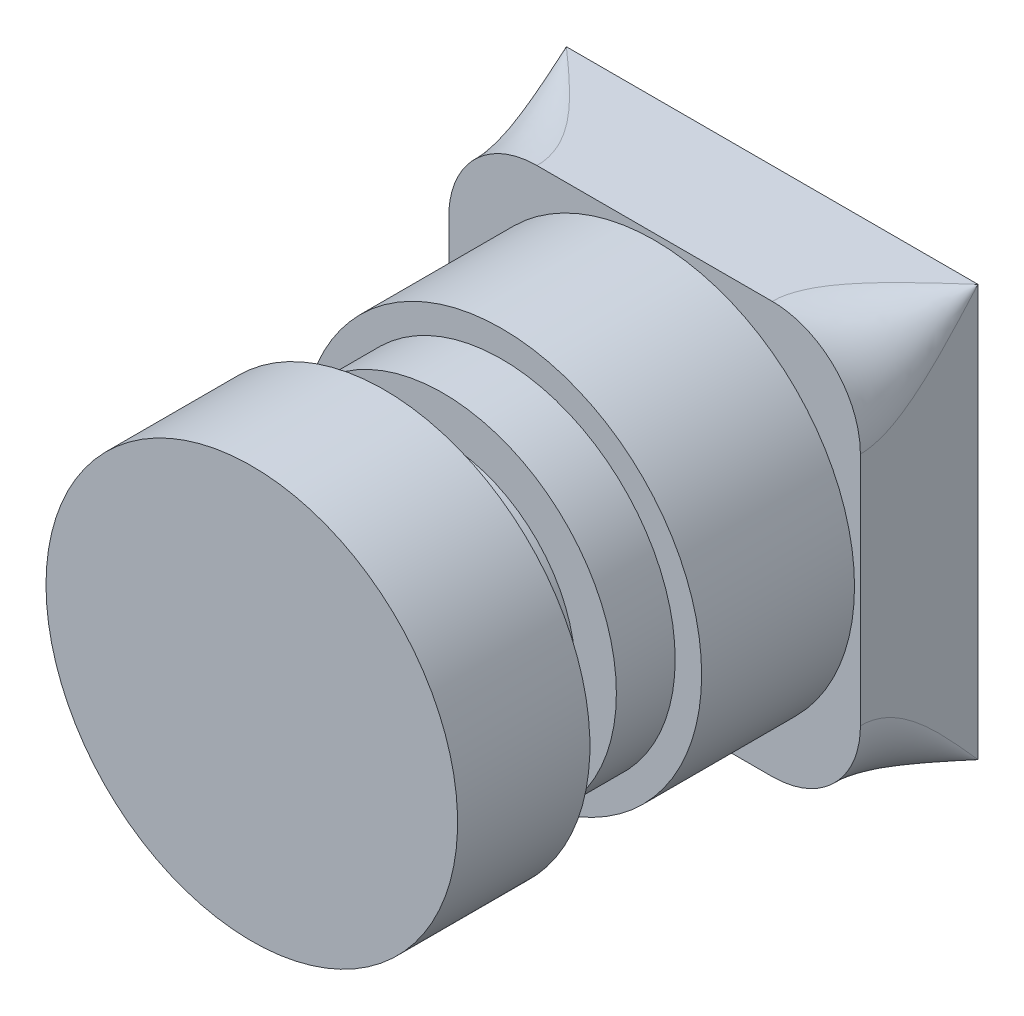
ISO-10303-21;
HEADER;
FILE_DESCRIPTION(('STEP AP214'),'2;1');
FILE_NAME('part.step','',(''),(''),'','','');
FILE_SCHEMA(('AUTOMOTIVE_DESIGN { 1 0 10303 214 1 1 1 1 }'));
ENDSEC;
DATA;
#1=APPLICATION_CONTEXT('core data for automotive mechanical design processes');
#2=APPLICATION_PROTOCOL_DEFINITION('international standard','automotive_design',2000,#1);
#3=PRODUCT_CONTEXT('',#1,'mechanical');
#4=PRODUCT('Part','Part','',(#3));
#5=PRODUCT_RELATED_PRODUCT_CATEGORY('part','',(#4));
#6=PRODUCT_DEFINITION_FORMATION('','',#4);
#7=PRODUCT_DEFINITION_CONTEXT('part definition',#1,'design');
#8=PRODUCT_DEFINITION('design','',#6,#7);
#9=PRODUCT_DEFINITION_SHAPE('','',#8);
#10=(LENGTH_UNIT() NAMED_UNIT(*) SI_UNIT(.MILLI.,.METRE.));
#11=(NAMED_UNIT(*) PLANE_ANGLE_UNIT() SI_UNIT($,.RADIAN.));
#12=(NAMED_UNIT(*) SI_UNIT($,.STERADIAN.) SOLID_ANGLE_UNIT());
#13=UNCERTAINTY_MEASURE_WITH_UNIT(LENGTH_MEASURE(1.E-05),#10,'distance_accuracy_value','');
#14=(GEOMETRIC_REPRESENTATION_CONTEXT(3) GLOBAL_UNCERTAINTY_ASSIGNED_CONTEXT((#13)) GLOBAL_UNIT_ASSIGNED_CONTEXT((#10,
#11,#12)) REPRESENTATION_CONTEXT('',''));
#15=CARTESIAN_POINT('',(0.,0.,0.));
#16=DIRECTION('',(0.,0.,1.));
#17=DIRECTION('',(1.,0.,0.));
#18=AXIS2_PLACEMENT_3D('',#15,#16,#17);
#19=CARTESIAN_POINT('',(0.,0.,4.));
#20=DIRECTION('',(1.,0.,0.));
#21=DIRECTION('',(0.,0.,-1.));
#22=AXIS2_PLACEMENT_3D('',#19,#20,#21);
#23=PLANE('',#22);
#24=DIRECTION('',(0.,-1.,0.));
#25=VECTOR('',#24,1.);
#26=CARTESIAN_POINT('',(0.,0.,0.));
#27=LINE('',#26,#25);
#28=CARTESIAN_POINT('',(0.,14.,0.));
#29=VERTEX_POINT('',#28);
#30=CARTESIAN_POINT('',(0.,0.,0.));
#31=VERTEX_POINT('',#30);
#32=EDGE_CURVE('E120',#29,#31,#27,.T.);
#33=ORIENTED_EDGE('',*,*,#32,.T.);
#34=CARTESIAN_POINT('',(0.,3.,12.));
#35=CARTESIAN_POINT('',(0.,3.,9.33333333333333));
#36=CARTESIAN_POINT('',(0.,3.,6.66666666666667));
#37=CARTESIAN_POINT('',(0.,3.,4.));
#38=CARTESIAN_POINT('',(0.,3.,2.66666666666667));
#39=CARTESIAN_POINT('',(0.,1.5,1.33333333333333));
#40=CARTESIAN_POINT('',(0.,0.,0.));
#41=(BOUNDED_CURVE() B_SPLINE_CURVE(3,(#34,#35,#36,#37,#38,#39,#40),.UNSPECIFIED.,.F.,
.F.) B_SPLINE_CURVE_WITH_KNOTS((4,3,4),(-0.008,0.,0.004),
.UNSPECIFIED.) CURVE() GEOMETRIC_REPRESENTATION_ITEM() RATIONAL_B_SPLINE_CURVE((1.,1.,1.,1.,1.,
1.,1.)) REPRESENTATION_ITEM(''));
#42=CARTESIAN_POINT('',(0.,3.,4.));
#43=VERTEX_POINT('',#42);
#44=EDGE_CURVE('E94',#31,#43,#41,.F.);
#45=ORIENTED_EDGE('',*,*,#44,.T.);
#46=DIRECTION('',(0.,-1.,0.));
#47=VECTOR('',#46,1.);
#48=CARTESIAN_POINT('',(0.,0.,4.));
#49=LINE('',#48,#47);
#50=CARTESIAN_POINT('',(0.,11.,4.));
#51=VERTEX_POINT('',#50);
#52=EDGE_CURVE('E138',#51,#43,#49,.T.);
#53=ORIENTED_EDGE('',*,*,#52,.F.);
#54=CARTESIAN_POINT('',(0.,11.,12.));
#55=CARTESIAN_POINT('',(0.,11.,9.33333333333333));
#56=CARTESIAN_POINT('',(0.,11.,6.66666666666667));
#57=CARTESIAN_POINT('',(0.,11.,4.));
#58=CARTESIAN_POINT('',(0.,11.,2.66666666666667));
#59=CARTESIAN_POINT('',(0.,12.5,1.33333333333333));
#60=CARTESIAN_POINT('',(0.,14.,0.));
#61=(BOUNDED_CURVE() B_SPLINE_CURVE(3,(#54,#55,#56,#57,#58,#59,#60),.UNSPECIFIED.,.F.,
.F.) B_SPLINE_CURVE_WITH_KNOTS((4,3,4),(-0.008,0.,0.004),
.UNSPECIFIED.) CURVE() GEOMETRIC_REPRESENTATION_ITEM() RATIONAL_B_SPLINE_CURVE((1.,1.,1.,1.,1.,
1.,1.)) REPRESENTATION_ITEM(''));
#62=EDGE_CURVE('E103',#51,#29,#61,.T.);
#63=ORIENTED_EDGE('',*,*,#62,.T.);
#64=EDGE_LOOP('',(#33,#45,#53,#63));
#65=FACE_BOUND('',#64,.T.);
#66=ADVANCED_FACE('F36',(#65),#23,.F.);
#67=CARTESIAN_POINT('',(0.,0.,4.));
#68=DIRECTION('',(0.,1.,0.));
#69=DIRECTION('',(0.,0.,1.));
#70=AXIS2_PLACEMENT_3D('',#67,#68,#69);
#71=PLANE('',#70);
#72=DIRECTION('',(1.,0.,0.));
#73=VECTOR('',#72,1.);
#74=CARTESIAN_POINT('',(0.,0.,4.));
#75=LINE('',#74,#73);
#76=CARTESIAN_POINT('',(3.,0.,4.));
#77=VERTEX_POINT('',#76);
#78=CARTESIAN_POINT('',(11.,0.,4.));
#79=VERTEX_POINT('',#78);
#80=EDGE_CURVE('E113',#77,#79,#75,.T.);
#81=ORIENTED_EDGE('',*,*,#80,.F.);
#82=CARTESIAN_POINT('',(3.,0.,12.));
#83=CARTESIAN_POINT('',(3.,0.,9.33333333333333));
#84=CARTESIAN_POINT('',(3.,0.,6.66666666666667));
#85=CARTESIAN_POINT('',(3.,0.,4.));
#86=CARTESIAN_POINT('',(3.,0.,2.66666666666667));
#87=CARTESIAN_POINT('',(1.5,0.,1.33333333333333));
#88=CARTESIAN_POINT('',(0.,0.,0.));
#89=(BOUNDED_CURVE() B_SPLINE_CURVE(3,(#82,#83,#84,#85,#86,#87,#88),.UNSPECIFIED.,.F.,
.F.) B_SPLINE_CURVE_WITH_KNOTS((4,3,4),(-0.008,0.,0.004),
.UNSPECIFIED.) CURVE() GEOMETRIC_REPRESENTATION_ITEM() RATIONAL_B_SPLINE_CURVE((1.,1.,1.,1.,1.,
1.,1.)) REPRESENTATION_ITEM(''));
#90=EDGE_CURVE('E97',#77,#31,#89,.T.);
#91=ORIENTED_EDGE('',*,*,#90,.T.);
#92=DIRECTION('',(1.,0.,0.));
#93=VECTOR('',#92,1.);
#94=CARTESIAN_POINT('',(0.,0.,0.));
#95=LINE('',#94,#93);
#96=CARTESIAN_POINT('',(14.,0.,0.));
#97=VERTEX_POINT('',#96);
#98=EDGE_CURVE('E110',#31,#97,#95,.T.);
#99=ORIENTED_EDGE('',*,*,#98,.T.);
#100=CARTESIAN_POINT('',(11.,0.,12.));
#101=CARTESIAN_POINT('',(11.,0.,9.33333333333333));
#102=CARTESIAN_POINT('',(11.,0.,6.66666666666667));
#103=CARTESIAN_POINT('',(11.,0.,4.));
#104=CARTESIAN_POINT('',(11.,0.,2.66666666666667));
#105=CARTESIAN_POINT('',(12.5,0.,1.33333333333333));
#106=CARTESIAN_POINT('',(14.,0.,0.));
#107=(BOUNDED_CURVE() B_SPLINE_CURVE(3,(#100,#101,#102,#103,#104,#105,#106),.UNSPECIFIED.,.F.,
.F.) B_SPLINE_CURVE_WITH_KNOTS((4,3,4),(-0.008,0.,0.004),
.UNSPECIFIED.) CURVE() GEOMETRIC_REPRESENTATION_ITEM() RATIONAL_B_SPLINE_CURVE((1.,1.,1.,1.,1.,
1.,1.)) REPRESENTATION_ITEM(''));
#108=EDGE_CURVE('E114',#97,#79,#107,.F.);
#109=ORIENTED_EDGE('',*,*,#108,.T.);
#110=EDGE_LOOP('',(#81,#91,#99,#109));
#111=FACE_BOUND('',#110,.T.);
#112=ADVANCED_FACE('F109',(#111),#71,.F.);
#113=CARTESIAN_POINT('',(14.,0.,4.));
#114=DIRECTION('',(-1.,0.,0.));
#115=DIRECTION('',(0.,0.,1.));
#116=AXIS2_PLACEMENT_3D('',#113,#114,#115);
#117=PLANE('',#116);
#118=DIRECTION('',(0.,1.,0.));
#119=VECTOR('',#118,1.);
#120=CARTESIAN_POINT('',(14.,0.,4.));
#121=LINE('',#120,#119);
#122=CARTESIAN_POINT('',(14.,3.,4.));
#123=VERTEX_POINT('',#122);
#124=CARTESIAN_POINT('',(14.,11.,4.));
#125=VERTEX_POINT('',#124);
#126=EDGE_CURVE('E257',#123,#125,#121,.T.);
#127=ORIENTED_EDGE('',*,*,#126,.F.);
#128=CARTESIAN_POINT('',(14.,3.,12.));
#129=CARTESIAN_POINT('',(14.,3.,9.33333333333333));
#130=CARTESIAN_POINT('',(14.,3.,6.66666666666667));
#131=CARTESIAN_POINT('',(14.,3.,4.));
#132=CARTESIAN_POINT('',(14.,3.,2.66666666666667));
#133=CARTESIAN_POINT('',(14.,1.5,1.33333333333333));
#134=CARTESIAN_POINT('',(14.,0.,0.));
#135=(BOUNDED_CURVE() B_SPLINE_CURVE(3,(#128,#129,#130,#131,#132,#133,#134),.UNSPECIFIED.,.F.,
.F.) B_SPLINE_CURVE_WITH_KNOTS((4,3,4),(-0.008,0.,0.004),
.UNSPECIFIED.) CURVE() GEOMETRIC_REPRESENTATION_ITEM() RATIONAL_B_SPLINE_CURVE((1.,1.,1.,1.,1.,
1.,1.)) REPRESENTATION_ITEM(''));
#136=EDGE_CURVE('E252',#123,#97,#135,.T.);
#137=ORIENTED_EDGE('',*,*,#136,.T.);
#138=DIRECTION('',(0.,1.,0.));
#139=VECTOR('',#138,1.);
#140=CARTESIAN_POINT('',(14.,0.,0.));
#141=LINE('',#140,#139);
#142=CARTESIAN_POINT('',(14.,14.,0.));
#143=VERTEX_POINT('',#142);
#144=EDGE_CURVE('E122',#97,#143,#141,.T.);
#145=ORIENTED_EDGE('',*,*,#144,.T.);
#146=CARTESIAN_POINT('',(14.,11.,12.));
#147=CARTESIAN_POINT('',(14.,11.,9.33333333333333));
#148=CARTESIAN_POINT('',(14.,11.,6.66666666666667));
#149=CARTESIAN_POINT('',(14.,11.,4.));
#150=CARTESIAN_POINT('',(14.,11.,2.66666666666667));
#151=CARTESIAN_POINT('',(14.,12.5,1.33333333333333));
#152=CARTESIAN_POINT('',(14.,14.,0.));
#153=(BOUNDED_CURVE() B_SPLINE_CURVE(3,(#146,#147,#148,#149,#150,#151,#152),.UNSPECIFIED.,.F.,
.F.) B_SPLINE_CURVE_WITH_KNOTS((4,3,4),(-0.008,0.,0.004),
.UNSPECIFIED.) CURVE() GEOMETRIC_REPRESENTATION_ITEM() RATIONAL_B_SPLINE_CURVE((1.,1.,1.,1.,1.,
1.,1.)) REPRESENTATION_ITEM(''));
#154=EDGE_CURVE('E255',#143,#125,#153,.F.);
#155=ORIENTED_EDGE('',*,*,#154,.T.);
#156=EDGE_LOOP('',(#127,#137,#145,#155));
#157=FACE_BOUND('',#156,.T.);
#158=ADVANCED_FACE('F242',(#157),#117,.F.);
#159=CARTESIAN_POINT('',(0.,14.,4.));
#160=DIRECTION('',(0.,-1.,0.));
#161=DIRECTION('',(0.,0.,-1.));
#162=AXIS2_PLACEMENT_3D('',#159,#160,#161);
#163=PLANE('',#162);
#164=DIRECTION('',(-1.,0.,0.));
#165=VECTOR('',#164,1.);
#166=CARTESIAN_POINT('',(0.,14.,0.));
#167=LINE('',#166,#165);
#168=EDGE_CURVE('E136',#143,#29,#167,.T.);
#169=ORIENTED_EDGE('',*,*,#168,.T.);
#170=CARTESIAN_POINT('',(3.,14.,12.));
#171=CARTESIAN_POINT('',(3.,14.,9.33333333333333));
#172=CARTESIAN_POINT('',(3.,14.,6.66666666666667));
#173=CARTESIAN_POINT('',(3.,14.,4.));
#174=CARTESIAN_POINT('',(3.,14.,2.66666666666667));
#175=CARTESIAN_POINT('',(1.5,14.,1.33333333333333));
#176=CARTESIAN_POINT('',(0.,14.,0.));
#177=(BOUNDED_CURVE() B_SPLINE_CURVE(3,(#170,#171,#172,#173,#174,#175,#176),.UNSPECIFIED.,.F.,
.F.) B_SPLINE_CURVE_WITH_KNOTS((4,3,4),(-0.008,0.,0.004),
.UNSPECIFIED.) CURVE() GEOMETRIC_REPRESENTATION_ITEM() RATIONAL_B_SPLINE_CURVE((1.,1.,1.,1.,1.,
1.,1.)) REPRESENTATION_ITEM(''));
#178=CARTESIAN_POINT('',(3.,14.,4.));
#179=VERTEX_POINT('',#178);
#180=EDGE_CURVE('E12',#29,#179,#177,.F.);
#181=ORIENTED_EDGE('',*,*,#180,.T.);
#182=DIRECTION('',(-1.,0.,0.));
#183=VECTOR('',#182,1.);
#184=CARTESIAN_POINT('',(0.,14.,4.));
#185=LINE('',#184,#183);
#186=CARTESIAN_POINT('',(11.,14.,4.));
#187=VERTEX_POINT('',#186);
#188=EDGE_CURVE('E132',#187,#179,#185,.T.);
#189=ORIENTED_EDGE('',*,*,#188,.F.);
#190=CARTESIAN_POINT('',(11.,14.,12.));
#191=CARTESIAN_POINT('',(11.,14.,9.33333333333333));
#192=CARTESIAN_POINT('',(11.,14.,6.66666666666667));
#193=CARTESIAN_POINT('',(11.,14.,4.));
#194=CARTESIAN_POINT('',(11.,14.,2.66666666666667));
#195=CARTESIAN_POINT('',(12.5,14.,1.33333333333333));
#196=CARTESIAN_POINT('',(14.,14.,0.));
#197=(BOUNDED_CURVE() B_SPLINE_CURVE(3,(#190,#191,#192,#193,#194,#195,#196),.UNSPECIFIED.,.F.,
.F.) B_SPLINE_CURVE_WITH_KNOTS((4,3,4),(-0.008,0.,0.004),
.UNSPECIFIED.) CURVE() GEOMETRIC_REPRESENTATION_ITEM() RATIONAL_B_SPLINE_CURVE((1.,1.,1.,1.,1.,
1.,1.)) REPRESENTATION_ITEM(''));
#198=EDGE_CURVE('E50',#187,#143,#197,.T.);
#199=ORIENTED_EDGE('',*,*,#198,.T.);
#200=EDGE_LOOP('',(#169,#181,#189,#199));
#201=FACE_BOUND('',#200,.T.);
#202=ADVANCED_FACE('F179',(#201),#163,.F.);
#203=CARTESIAN_POINT('',(0.,0.,4.));
#204=DIRECTION('',(0.,0.,-1.));
#205=DIRECTION('',(-1.,0.,0.));
#206=AXIS2_PLACEMENT_3D('',#203,#204,#205);
#207=PLANE('',#206);
#208=CARTESIAN_POINT('',(7.,7.,4.));
#209=DIRECTION('',(0.,0.,1.));
#210=DIRECTION('',(1.,0.,0.));
#211=AXIS2_PLACEMENT_3D('',#208,#209,#210);
#212=CIRCLE('',#211,6.8);
#213=CARTESIAN_POINT('',(13.8,7.,4.));
#214=VERTEX_POINT('',#213);
#215=EDGE_CURVE('E278',#214,#214,#212,.T.);
#216=ORIENTED_EDGE('',*,*,#215,.F.);
#217=EDGE_LOOP('',(#216));
#218=FACE_BOUND('',#217,.T.);
#219=ORIENTED_EDGE('',*,*,#52,.T.);
#220=CARTESIAN_POINT('',(0.,3.,4.));
#221=CARTESIAN_POINT('',(-8.08512375426328E-06,2.91562013649799,4.));
#222=CARTESIAN_POINT('',(0.00355995162264423,2.83124410523888,4.));
#223=CARTESIAN_POINT('',(0.0177857007479929,2.66309573936921,4.));
#224=CARTESIAN_POINT('',(0.0284430730384649,2.57932337599445,4.));
#225=CARTESIAN_POINT('',(0.0567742285179942,2.41303301905162,4.));
#226=CARTESIAN_POINT('',(0.0744427038981918,2.33051412549009,4.));
#227=CARTESIAN_POINT('',(0.116652747335968,2.16727818478114,4.));
#228=CARTESIAN_POINT('',(0.141194231493421,2.0865611156515,4.));
#229=CARTESIAN_POINT('',(0.224929944624958,1.847891457112,4.));
#230=CARTESIAN_POINT('',(0.294247025077906,1.69335274509202,4.));
#231=CARTESIAN_POINT('',(0.457796261562583,1.39821978961286,4.));
#232=CARTESIAN_POINT('',(0.552024028486161,1.25762309565171,4.));
#233=CARTESIAN_POINT('',(0.762751358266794,0.994221314761145,4.));
#234=CARTESIAN_POINT('',(0.879250703768931,0.871416054220423,4.));
#235=CARTESIAN_POINT('',(1.13123799410231,0.647088707336546,4.));
#236=CARTESIAN_POINT('',(1.26672964915768,0.545570789256474,4.));
#237=CARTESIAN_POINT('',(1.5528473380978,0.366707769393569,4.));
#238=CARTESIAN_POINT('',(1.70347632731634,0.289367400071862,4.));
#239=CARTESIAN_POINT('',(2.01555094289607,0.161113391347868,4.));
#240=CARTESIAN_POINT('',(2.17699017122762,0.110184273862236,4.));
#241=CARTESIAN_POINT('',(2.44951444579427,0.0488546089371446,4.));
#242=CARTESIAN_POINT('',(2.55888510833517,0.030545198105381,4.));
#243=CARTESIAN_POINT('',(2.77882189916016,0.00611949579793181,4.));
#244=CARTESIAN_POINT('',(2.88938610828128,-1.40815860660997E-05,4.));
#245=CARTESIAN_POINT('',(3.,0.,4.));
#246=B_SPLINE_CURVE_WITH_KNOTS('',3,(#220,#221,#222,#223,#224,#225,#226,#227,#228,#229,#230,
#231,#232,#233,#234,#235,#236,#237,#238,#239,#240,#241,#242,#243,#244,#245),.UNSPECIFIED.,.F.,
.F.,(4,2,2,2,2,2,2,2,2,2,2,2,4),(0.,0.25305726766033,0.506102396573003,0.758956320118842,
1.01180715716324,1.5173054551224,2.02271474671429,2.52811910611931,3.03362233625857,
3.53922445064309,4.04452992552634,4.3765766842447,4.70815170142137),.UNSPECIFIED.);
#247=EDGE_CURVE('E98',#43,#77,#246,.T.);
#248=ORIENTED_EDGE('',*,*,#247,.T.);
#249=ORIENTED_EDGE('',*,*,#80,.T.);
#250=CARTESIAN_POINT('',(11.,0.,4.));
#251=CARTESIAN_POINT('',(11.084379863502,-8.08512375443882E-06,4.));
#252=CARTESIAN_POINT('',(11.1687558947611,0.00355995162264411,4.));
#253=CARTESIAN_POINT('',(11.3369042606308,0.0177857007479928,4.));
#254=CARTESIAN_POINT('',(11.4206766240056,0.0284430730384648,4.));
#255=CARTESIAN_POINT('',(11.5869669809484,0.0567742285179935,4.));
#256=CARTESIAN_POINT('',(11.6694858745099,0.0744427038981905,4.));
#257=CARTESIAN_POINT('',(11.8327218152189,0.116652747335967,4.));
#258=CARTESIAN_POINT('',(11.9134388843485,0.14119423149342,4.));
#259=CARTESIAN_POINT('',(12.152108542888,0.224929944624956,4.));
#260=CARTESIAN_POINT('',(12.306647254908,0.294247025077903,4.));
#261=CARTESIAN_POINT('',(12.6017802103871,0.457796261562579,4.));
#262=CARTESIAN_POINT('',(12.7423769043483,0.552024028486157,4.));
#263=CARTESIAN_POINT('',(13.0057786852389,0.76275135826679,4.));
#264=CARTESIAN_POINT('',(13.1285839457796,0.879250703768927,4.));
#265=CARTESIAN_POINT('',(13.3529112926635,1.1312379941023,4.));
#266=CARTESIAN_POINT('',(13.4544292107435,1.26672964915768,4.));
#267=CARTESIAN_POINT('',(13.6332922306064,1.5528473380978,4.));
#268=CARTESIAN_POINT('',(13.7106325999281,1.70347632731633,4.));
#269=CARTESIAN_POINT('',(13.8388866086521,2.01555094289606,4.));
#270=CARTESIAN_POINT('',(13.8898157261378,2.17699017122761,4.));
#271=CARTESIAN_POINT('',(13.9511453910629,2.44951444579426,4.));
#272=CARTESIAN_POINT('',(13.9694548018946,2.55888510833517,4.));
#273=CARTESIAN_POINT('',(13.9938805042021,2.77882189916016,4.));
#274=CARTESIAN_POINT('',(14.0000140815861,2.88938610828128,4.));
#275=CARTESIAN_POINT('',(14.,3.,4.));
#276=B_SPLINE_CURVE_WITH_KNOTS('',3,(#250,#251,#252,#253,#254,#255,#256,#257,#258,#259,#260,
#261,#262,#263,#264,#265,#266,#267,#268,#269,#270,#271,#272,#273,#274,#275),.UNSPECIFIED.,.F.,
.F.,(4,2,2,2,2,2,2,2,2,2,2,2,4),(0.,0.253057267660328,0.506102396572999,0.758956320118838,
1.01180715716324,1.51730545512239,2.02271474671428,2.52811910611931,3.03362233625857,
3.53922445064309,4.04452992552633,4.37657668424469,4.70815170142137),.UNSPECIFIED.);
#277=EDGE_CURVE('E188',#79,#123,#276,.T.);
#278=ORIENTED_EDGE('',*,*,#277,.T.);
#279=ORIENTED_EDGE('',*,*,#126,.T.);
#280=CARTESIAN_POINT('',(14.,11.,4.));
#281=CARTESIAN_POINT('',(14.0000080851238,11.084379863502,4.));
#282=CARTESIAN_POINT('',(13.9964400483774,11.1687558947611,4.));
#283=CARTESIAN_POINT('',(13.982214299252,11.3369042606308,4.));
#284=CARTESIAN_POINT('',(13.9715569269615,11.4206766240056,4.));
#285=CARTESIAN_POINT('',(13.943225771482,11.5869669809484,4.));
#286=CARTESIAN_POINT('',(13.9255572961018,11.6694858745099,4.));
#287=CARTESIAN_POINT('',(13.883347252664,11.8327218152189,4.));
#288=CARTESIAN_POINT('',(13.8588057685066,11.9134388843485,4.));
#289=CARTESIAN_POINT('',(13.775070055375,12.152108542888,4.));
#290=CARTESIAN_POINT('',(13.7057529749221,12.306647254908,4.));
#291=CARTESIAN_POINT('',(13.5422037384374,12.6017802103871,4.));
#292=CARTESIAN_POINT('',(13.4479759715138,12.7423769043483,4.));
#293=CARTESIAN_POINT('',(13.2372486417332,13.0057786852389,4.));
#294=CARTESIAN_POINT('',(13.1207492962311,13.1285839457796,4.));
#295=CARTESIAN_POINT('',(12.8687620058977,13.3529112926635,4.));
#296=CARTESIAN_POINT('',(12.7332703508423,13.4544292107435,4.));
#297=CARTESIAN_POINT('',(12.4471526619022,13.6332922306064,4.));
#298=CARTESIAN_POINT('',(12.2965236726837,13.7106325999281,4.));
#299=CARTESIAN_POINT('',(11.9844490571039,13.8388866086521,4.));
#300=CARTESIAN_POINT('',(11.8230098287724,13.8898157261378,4.));
#301=CARTESIAN_POINT('',(11.5504855542057,13.9511453910629,4.));
#302=CARTESIAN_POINT('',(11.4411148916648,13.9694548018946,4.));
#303=CARTESIAN_POINT('',(11.2211781008398,13.9938805042021,4.));
#304=CARTESIAN_POINT('',(11.1106138917187,14.0000140815861,4.));
#305=CARTESIAN_POINT('',(11.,14.,4.));
#306=B_SPLINE_CURVE_WITH_KNOTS('',3,(#280,#281,#282,#283,#284,#285,#286,#287,#288,#289,#290,
#291,#292,#293,#294,#295,#296,#297,#298,#299,#300,#301,#302,#303,#304,#305),.UNSPECIFIED.,.F.,
.F.,(4,2,2,2,2,2,2,2,2,2,2,2,4),(0.,0.253057267660328,0.506102396573001,0.758956320118839,
1.01180715716324,1.51730545512239,2.02271474671429,2.52811910611931,3.03362233625857,
3.53922445064308,4.04452992552633,4.37657668424469,4.70815170142137),.UNSPECIFIED.);
#307=EDGE_CURVE('E62',#125,#187,#306,.T.);
#308=ORIENTED_EDGE('',*,*,#307,.T.);
#309=ORIENTED_EDGE('',*,*,#188,.T.);
#310=CARTESIAN_POINT('',(3.,14.,4.));
#311=CARTESIAN_POINT('',(2.91562013649799,14.0000080851238,4.));
#312=CARTESIAN_POINT('',(2.83124410523888,13.9964400483774,4.));
#313=CARTESIAN_POINT('',(2.66309573936921,13.982214299252,4.));
#314=CARTESIAN_POINT('',(2.57932337599445,13.9715569269615,4.));
#315=CARTESIAN_POINT('',(2.41303301905162,13.943225771482,4.));
#316=CARTESIAN_POINT('',(2.33051412549009,13.9255572961018,4.));
#317=CARTESIAN_POINT('',(2.16727818478114,13.883347252664,4.));
#318=CARTESIAN_POINT('',(2.0865611156515,13.8588057685066,4.));
#319=CARTESIAN_POINT('',(1.847891457112,13.775070055375,4.));
#320=CARTESIAN_POINT('',(1.69335274509202,13.7057529749221,4.));
#321=CARTESIAN_POINT('',(1.39821978961286,13.5422037384374,4.));
#322=CARTESIAN_POINT('',(1.25762309565171,13.4479759715138,4.));
#323=CARTESIAN_POINT('',(0.994221314761146,13.2372486417332,4.));
#324=CARTESIAN_POINT('',(0.871416054220425,13.1207492962311,4.));
#325=CARTESIAN_POINT('',(0.647088707336549,12.8687620058977,4.));
#326=CARTESIAN_POINT('',(0.545570789256476,12.7332703508423,4.));
#327=CARTESIAN_POINT('',(0.36670776939357,12.4471526619022,4.));
#328=CARTESIAN_POINT('',(0.289367400071864,12.2965236726837,4.));
#329=CARTESIAN_POINT('',(0.161113391347869,11.9844490571039,4.));
#330=CARTESIAN_POINT('',(0.110184273862237,11.8230098287724,4.));
#331=CARTESIAN_POINT('',(0.0488546089371446,11.5504855542057,4.));
#332=CARTESIAN_POINT('',(0.0305451981053809,11.4411148916648,4.));
#333=CARTESIAN_POINT('',(0.00611949579793182,11.2211781008398,4.));
#334=CARTESIAN_POINT('',(-1.40815860660403E-05,11.1106138917187,4.));
#335=CARTESIAN_POINT('',(0.,11.,4.));
#336=B_SPLINE_CURVE_WITH_KNOTS('',3,(#310,#311,#312,#313,#314,#315,#316,#317,#318,#319,#320,
#321,#322,#323,#324,#325,#326,#327,#328,#329,#330,#331,#332,#333,#334,#335),.UNSPECIFIED.,.F.,
.F.,(4,2,2,2,2,2,2,2,2,2,2,2,4),(0.,0.253057267660331,0.506102396573003,0.758956320118843,
1.01180715716324,1.5173054551224,2.02271474671429,2.52811910611931,3.03362233625857,
3.53922445064309,4.04452992552634,4.3765766842447,4.70815170142137),.UNSPECIFIED.);
#337=EDGE_CURVE('E168',#179,#51,#336,.T.);
#338=ORIENTED_EDGE('',*,*,#337,.T.);
#339=EDGE_LOOP('',(#219,#248,#249,#278,#279,#308,#309,#338));
#340=FACE_BOUND('',#339,.T.);
#341=ADVANCED_FACE('F174',(#218,#340),#207,.F.);
#342=CARTESIAN_POINT('',(0.,0.,0.));
#343=DIRECTION('',(0.,0.,-1.));
#344=DIRECTION('',(-1.,0.,0.));
#345=AXIS2_PLACEMENT_3D('',#342,#343,#344);
#346=PLANE('',#345);
#347=ORIENTED_EDGE('',*,*,#32,.F.);
#348=ORIENTED_EDGE('',*,*,#168,.F.);
#349=ORIENTED_EDGE('',*,*,#144,.F.);
#350=ORIENTED_EDGE('',*,*,#98,.F.);
#351=EDGE_LOOP('',(#347,#348,#349,#350));
#352=FACE_BOUND('',#351,.T.);
#353=ADVANCED_FACE('F118',(#352),#346,.T.);
#354=CARTESIAN_POINT('',(7.,7.,9.2));
#355=DIRECTION('',(0.,0.,-1.));
#356=DIRECTION('',(-1.,0.,0.));
#357=AXIS2_PLACEMENT_3D('',#354,#355,#356);
#358=CYLINDRICAL_SURFACE('',#357,6.8);
#359=CARTESIAN_POINT('',(7.,7.,9.2));
#360=DIRECTION('',(0.,0.,1.));
#361=DIRECTION('',(1.,0.,0.));
#362=AXIS2_PLACEMENT_3D('',#359,#360,#361);
#363=CIRCLE('',#362,6.8);
#364=CARTESIAN_POINT('',(13.8,7.,9.2));
#365=VERTEX_POINT('',#364);
#366=EDGE_CURVE('E126',#365,#365,#363,.T.);
#367=ORIENTED_EDGE('',*,*,#366,.F.);
#368=EDGE_LOOP('',(#367));
#369=FACE_BOUND('',#368,.T.);
#370=ORIENTED_EDGE('',*,*,#215,.T.);
#371=EDGE_LOOP('',(#370));
#372=FACE_BOUND('',#371,.T.);
#373=ADVANCED_FACE('F181',(#369,#372),#358,.T.);
#374=CARTESIAN_POINT('',(7.,7.,9.2));
#375=DIRECTION('',(0.,0.,1.));
#376=DIRECTION('',(1.,0.,0.));
#377=AXIS2_PLACEMENT_3D('',#374,#375,#376);
#378=PLANE('',#377);
#379=CARTESIAN_POINT('',(7.,7.,9.2));
#380=DIRECTION('',(0.,0.,1.));
#381=DIRECTION('',(1.,0.,0.));
#382=AXIS2_PLACEMENT_3D('',#379,#380,#381);
#383=CIRCLE('',#382,5.9);
#384=CARTESIAN_POINT('',(12.9,7.,9.2));
#385=VERTEX_POINT('',#384);
#386=EDGE_CURVE('E280',#385,#385,#383,.T.);
#387=ORIENTED_EDGE('',*,*,#386,.F.);
#388=EDGE_LOOP('',(#387));
#389=FACE_BOUND('',#388,.T.);
#390=ORIENTED_EDGE('',*,*,#366,.T.);
#391=EDGE_LOOP('',(#390));
#392=FACE_BOUND('',#391,.T.);
#393=ADVANCED_FACE('F326',(#389,#392),#378,.T.);
#394=CARTESIAN_POINT('',(7.,7.,11.2));
#395=DIRECTION('',(0.,0.,-1.));
#396=DIRECTION('',(-1.,0.,0.));
#397=AXIS2_PLACEMENT_3D('',#394,#395,#396);
#398=CYLINDRICAL_SURFACE('',#397,5.9);
#399=CARTESIAN_POINT('',(7.,7.,11.2));
#400=DIRECTION('',(0.,0.,1.));
#401=DIRECTION('',(1.,0.,0.));
#402=AXIS2_PLACEMENT_3D('',#399,#400,#401);
#403=CIRCLE('',#402,5.9);
#404=CARTESIAN_POINT('',(12.9,7.,11.2));
#405=VERTEX_POINT('',#404);
#406=EDGE_CURVE('E129',#405,#405,#403,.T.);
#407=ORIENTED_EDGE('',*,*,#406,.F.);
#408=EDGE_LOOP('',(#407));
#409=FACE_BOUND('',#408,.T.);
#410=ORIENTED_EDGE('',*,*,#386,.T.);
#411=EDGE_LOOP('',(#410));
#412=FACE_BOUND('',#411,.T.);
#413=ADVANCED_FACE('F323',(#409,#412),#398,.T.);
#414=CARTESIAN_POINT('',(7.,7.,11.2));
#415=DIRECTION('',(0.,0.,1.));
#416=DIRECTION('',(1.,0.,0.));
#417=AXIS2_PLACEMENT_3D('',#414,#415,#416);
#418=PLANE('',#417);
#419=CARTESIAN_POINT('',(7.,7.,11.2));
#420=DIRECTION('',(0.,0.,1.));
#421=DIRECTION('',(1.,0.,0.));
#422=AXIS2_PLACEMENT_3D('',#419,#420,#421);
#423=CIRCLE('',#422,4.5);
#424=CARTESIAN_POINT('',(11.5,7.,11.2));
#425=VERTEX_POINT('',#424);
#426=EDGE_CURVE('E141',#425,#425,#423,.T.);
#427=ORIENTED_EDGE('',*,*,#426,.F.);
#428=EDGE_LOOP('',(#427));
#429=FACE_BOUND('',#428,.T.);
#430=ORIENTED_EDGE('',*,*,#406,.T.);
#431=EDGE_LOOP('',(#430));
#432=FACE_BOUND('',#431,.T.);
#433=ADVANCED_FACE('F316',(#429,#432),#418,.T.);
#434=CARTESIAN_POINT('',(7.,7.,13.2));
#435=DIRECTION('',(0.,0.,-1.));
#436=DIRECTION('',(-1.,0.,0.));
#437=AXIS2_PLACEMENT_3D('',#434,#435,#436);
#438=CYLINDRICAL_SURFACE('',#437,4.5);
#439=CARTESIAN_POINT('',(7.,7.,13.2));
#440=DIRECTION('',(0.,0.,1.));
#441=DIRECTION('',(1.,0.,0.));
#442=AXIS2_PLACEMENT_3D('',#439,#440,#441);
#443=CIRCLE('',#442,4.5);
#444=CARTESIAN_POINT('',(11.5,7.,13.2));
#445=VERTEX_POINT('',#444);
#446=EDGE_CURVE('E291',#445,#445,#443,.T.);
#447=ORIENTED_EDGE('',*,*,#446,.F.);
#448=EDGE_LOOP('',(#447));
#449=FACE_BOUND('',#448,.T.);
#450=ORIENTED_EDGE('',*,*,#426,.T.);
#451=EDGE_LOOP('',(#450));
#452=FACE_BOUND('',#451,.T.);
#453=ADVANCED_FACE('F306',(#449,#452),#438,.T.);
#454=CARTESIAN_POINT('',(7.,7.,13.2));
#455=DIRECTION('',(0.,0.,1.));
#456=DIRECTION('',(1.,0.,0.));
#457=AXIS2_PLACEMENT_3D('',#454,#455,#456);
#458=PLANE('',#457);
#459=ORIENTED_EDGE('',*,*,#446,.T.);
#460=EDGE_LOOP('',(#459));
#461=FACE_BOUND('',#460,.T.);
#462=CARTESIAN_POINT('',(7.,7.,13.2));
#463=DIRECTION('',(0.,0.,1.));
#464=DIRECTION('',(1.,0.,0.));
#465=AXIS2_PLACEMENT_3D('',#462,#463,#464);
#466=CIRCLE('',#465,7.);
#467=CARTESIAN_POINT('',(0.,7.,13.2));
#468=VERTEX_POINT('',#467);
#469=EDGE_CURVE('E298',#468,#468,#466,.T.);
#470=ORIENTED_EDGE('',*,*,#469,.F.);
#471=EDGE_LOOP('',(#470));
#472=FACE_BOUND('',#471,.T.);
#473=ADVANCED_FACE('F304',(#461,#472),#458,.F.);
#474=CARTESIAN_POINT('',(7.,7.,55.1989898732233));
#475=DIRECTION('',(0.,0.,-1.));
#476=DIRECTION('',(-1.,0.,0.));
#477=AXIS2_PLACEMENT_3D('',#474,#475,#476);
#478=CYLINDRICAL_SURFACE('',#477,7.);
#479=CARTESIAN_POINT('',(7.,7.,17.7));
#480=DIRECTION('',(0.,0.,-1.));
#481=DIRECTION('',(-1.,0.,0.));
#482=AXIS2_PLACEMENT_3D('',#479,#480,#481);
#483=CIRCLE('',#482,7.);
#484=CARTESIAN_POINT('',(0.,7.,17.7));
#485=VERTEX_POINT('',#484);
#486=EDGE_CURVE('E295',#485,#485,#483,.T.);
#487=CARTESIAN_POINT('',(0.,7.,17.7));
#488=CARTESIAN_POINT('',(0.,7.,17.653125));
#489=CARTESIAN_POINT('',(0.,7.,17.60625));
#490=CARTESIAN_POINT('',(0.,7.,17.5125));
#491=CARTESIAN_POINT('',(0.,7.,17.465625));
#492=CARTESIAN_POINT('',(0.,7.,17.371875));
#493=CARTESIAN_POINT('',(0.,7.,17.325));
#494=CARTESIAN_POINT('',(0.,7.,17.23125));
#495=CARTESIAN_POINT('',(0.,7.,17.184375));
#496=CARTESIAN_POINT('',(0.,7.,17.090625));
#497=CARTESIAN_POINT('',(0.,7.,17.04375));
#498=CARTESIAN_POINT('',(0.,7.,16.95));
#499=CARTESIAN_POINT('',(0.,7.,16.903125));
#500=CARTESIAN_POINT('',(0.,7.,16.809375));
#501=CARTESIAN_POINT('',(0.,7.,16.7625));
#502=CARTESIAN_POINT('',(0.,7.,16.66875));
#503=CARTESIAN_POINT('',(0.,7.,16.621875));
#504=CARTESIAN_POINT('',(0.,7.,16.528125));
#505=CARTESIAN_POINT('',(0.,7.,16.48125));
#506=CARTESIAN_POINT('',(0.,7.,16.3875));
#507=CARTESIAN_POINT('',(0.,7.,16.340625));
#508=CARTESIAN_POINT('',(0.,7.,16.246875));
#509=CARTESIAN_POINT('',(0.,7.,16.2));
#510=CARTESIAN_POINT('',(0.,7.,16.10625));
#511=CARTESIAN_POINT('',(0.,7.,16.059375));
#512=CARTESIAN_POINT('',(0.,7.,15.965625));
#513=CARTESIAN_POINT('',(0.,7.,15.91875));
#514=CARTESIAN_POINT('',(0.,7.,15.825));
#515=CARTESIAN_POINT('',(0.,7.,15.778125));
#516=CARTESIAN_POINT('',(0.,7.,15.684375));
#517=CARTESIAN_POINT('',(0.,7.,15.6375));
#518=CARTESIAN_POINT('',(0.,7.,15.54375));
#519=CARTESIAN_POINT('',(0.,7.,15.496875));
#520=CARTESIAN_POINT('',(0.,7.,15.403125));
#521=CARTESIAN_POINT('',(0.,7.,15.35625));
#522=CARTESIAN_POINT('',(0.,7.,15.2625));
#523=CARTESIAN_POINT('',(0.,7.,15.215625));
#524=CARTESIAN_POINT('',(0.,7.,15.121875));
#525=CARTESIAN_POINT('',(0.,7.,15.075));
#526=CARTESIAN_POINT('',(0.,7.,14.98125));
#527=CARTESIAN_POINT('',(0.,7.,14.934375));
#528=CARTESIAN_POINT('',(0.,7.,14.840625));
#529=CARTESIAN_POINT('',(0.,7.,14.79375));
#530=CARTESIAN_POINT('',(0.,7.,14.7));
#531=CARTESIAN_POINT('',(0.,7.,14.653125));
#532=CARTESIAN_POINT('',(0.,7.,14.559375));
#533=CARTESIAN_POINT('',(0.,7.,14.5125));
#534=CARTESIAN_POINT('',(0.,7.,14.41875));
#535=CARTESIAN_POINT('',(0.,7.,14.371875));
#536=CARTESIAN_POINT('',(0.,7.,14.278125));
#537=CARTESIAN_POINT('',(0.,7.,14.23125));
#538=CARTESIAN_POINT('',(0.,7.,14.1375));
#539=CARTESIAN_POINT('',(0.,7.,14.090625));
#540=CARTESIAN_POINT('',(0.,7.,13.996875));
#541=CARTESIAN_POINT('',(0.,7.,13.95));
#542=CARTESIAN_POINT('',(0.,7.,13.85625));
#543=CARTESIAN_POINT('',(0.,7.,13.809375));
#544=CARTESIAN_POINT('',(0.,7.,13.715625));
#545=CARTESIAN_POINT('',(0.,7.,13.66875));
#546=CARTESIAN_POINT('',(0.,7.,13.575));
#547=CARTESIAN_POINT('',(0.,7.,13.528125));
#548=CARTESIAN_POINT('',(0.,7.,13.434375));
#549=CARTESIAN_POINT('',(0.,7.,13.3875));
#550=CARTESIAN_POINT('',(0.,7.,13.29375));
#551=CARTESIAN_POINT('',(0.,7.,13.246875));
#552=CARTESIAN_POINT('',(0.,7.,13.2));
#553=B_SPLINE_CURVE_WITH_KNOTS('',3,(#487,#488,#489,#490,#491,#492,#493,#494,#495,#496,#497,
#498,#499,#500,#501,#502,#503,#504,#505,#506,#507,#508,#509,#510,#511,#512,#513,#514,#515,#516,
#517,#518,#519,#520,#521,#522,#523,#524,#525,#526,#527,#528,#529,#530,#531,#532,#533,#534,#535,
#536,#537,#538,#539,#540,#541,#542,#543,#544,#545,#546,#547,#548,#549,#550,#551,#552),
.UNSPECIFIED.,.F.,.F.,(4,2,2,2,2,2,2,2,2,2,2,2,2,2,2,2,2,2,2,2,2,2,2,2,2,2,2,2,2,2,2,2,4),(0.,
0.140624999999998,0.281249999999997,0.421875000000002,0.5625,0.703124999999999,
0.843750000000004,0.984375000000003,1.125,1.265625,1.40625,1.546875,1.6875,1.828125,
1.96875000000001,2.109375,2.25,2.390625,2.53125,2.671875,2.8125,2.953125,3.09375000000001,
3.234375,3.375,3.515625,3.65625,3.79687500000001,3.9375,4.078125,4.21875000000001,
4.35937500000001,4.5),.UNSPECIFIED.);
#554=EDGE_CURVE('BSEAM302',#485,#468,#553,.T.);
#555=ORIENTED_EDGE('',*,*,#486,.T.);
#556=ORIENTED_EDGE('',*,*,#469,.T.);
#557=ORIENTED_EDGE('',*,*,#554,.T.);
#558=ORIENTED_EDGE('',*,*,#554,.F.);
#559=EDGE_LOOP('',(#555,#557,#556,#558));
#560=FACE_BOUND('',#559,.T.);
#561=ADVANCED_FACE('F302',(#560),#478,.T.);
#562=CARTESIAN_POINT('',(0.,0.,17.7));
#563=DIRECTION('',(0.,0.,-1.));
#564=DIRECTION('',(-1.,0.,0.));
#565=AXIS2_PLACEMENT_3D('',#562,#563,#564);
#566=PLANE('',#565);
#567=ORIENTED_EDGE('',*,*,#486,.F.);
#568=EDGE_LOOP('',(#567));
#569=FACE_BOUND('',#568,.T.);
#570=ADVANCED_FACE('F313',(#569),#566,.F.);
#571=CARTESIAN_POINT('',(3.,0.,4.8));
#572=CARTESIAN_POINT('',(3.,0.,4.53333333333334));
#573=CARTESIAN_POINT('',(3.,0.,4.26666666666667));
#574=CARTESIAN_POINT('',(3.,0.,4.));
#575=CARTESIAN_POINT('',(3.,0.,2.66666666666667));
#576=CARTESIAN_POINT('',(1.5,0.,1.33333333333333));
#577=CARTESIAN_POINT('',(0.,0.,0.));
#578=CARTESIAN_POINT('',(0.,0.,4.8));
#579=CARTESIAN_POINT('',(0.,0.,4.53333333333334));
#580=CARTESIAN_POINT('',(0.,0.,4.26666666666667));
#581=CARTESIAN_POINT('',(0.,0.,4.));
#582=CARTESIAN_POINT('',(0.,0.,2.66666666666667));
#583=CARTESIAN_POINT('',(0.,0.,1.33333333333333));
#584=CARTESIAN_POINT('',(0.,0.,0.));
#585=CARTESIAN_POINT('',(0.,3.,4.8));
#586=CARTESIAN_POINT('',(0.,3.,4.53333333333334));
#587=CARTESIAN_POINT('',(0.,3.,4.26666666666667));
#588=CARTESIAN_POINT('',(0.,3.,4.));
#589=CARTESIAN_POINT('',(0.,3.,2.66666666666667));
#590=CARTESIAN_POINT('',(0.,1.5,1.33333333333333));
#591=CARTESIAN_POINT('',(0.,0.,0.));
#592=(BOUNDED_SURFACE() B_SPLINE_SURFACE(2,3,((#571,#572,#573,#574,#575,#576,#577),(#578,#579,
#580,#581,#582,#583,#584),(#585,#586,#587,#588,#589,#590,#591)),.UNSPECIFIED.,.F.,.F.,
.F.) B_SPLINE_SURFACE_WITH_KNOTS((3,3),(4,3,4),(0.,1.),(-0.000800000000000002,0.,0.004),
.UNSPECIFIED.) GEOMETRIC_REPRESENTATION_ITEM() RATIONAL_B_SPLINE_SURFACE(((1.,1.,1.,1.,1.,1.,
1.),(0.707106781186548,0.707106781186548,0.707106781186548,0.707106781186548,0.707106781186548,
0.707106781186548,0.707106781186548),(1.,1.,1.,1.,1.,1.,1.))) REPRESENTATION_ITEM('') SURFACE());
#593=ORIENTED_EDGE('',*,*,#247,.F.);
#594=ORIENTED_EDGE('',*,*,#44,.F.);
#595=ORIENTED_EDGE('',*,*,#90,.F.);
#596=EDGE_LOOP('',(#593,#594,#595));
#597=FACE_BOUND('',#596,.T.);
#598=ADVANCED_FACE('F96',(#597),#592,.T.);
#599=CARTESIAN_POINT('',(14.,3.,4.8));
#600=CARTESIAN_POINT('',(14.,3.,4.53333333333334));
#601=CARTESIAN_POINT('',(14.,3.,4.26666666666667));
#602=CARTESIAN_POINT('',(14.,3.,4.));
#603=CARTESIAN_POINT('',(14.,3.,2.66666666666667));
#604=CARTESIAN_POINT('',(14.,1.5,1.33333333333333));
#605=CARTESIAN_POINT('',(14.,0.,0.));
#606=CARTESIAN_POINT('',(14.,0.,4.8));
#607=CARTESIAN_POINT('',(14.,0.,4.53333333333334));
#608=CARTESIAN_POINT('',(14.,0.,4.26666666666667));
#609=CARTESIAN_POINT('',(14.,0.,4.));
#610=CARTESIAN_POINT('',(14.,0.,2.66666666666667));
#611=CARTESIAN_POINT('',(14.,0.,1.33333333333333));
#612=CARTESIAN_POINT('',(14.,0.,0.));
#613=CARTESIAN_POINT('',(11.,0.,4.8));
#614=CARTESIAN_POINT('',(11.,0.,4.53333333333333));
#615=CARTESIAN_POINT('',(11.,0.,4.26666666666667));
#616=CARTESIAN_POINT('',(11.,0.,4.));
#617=CARTESIAN_POINT('',(11.,0.,2.66666666666667));
#618=CARTESIAN_POINT('',(12.5,0.,1.33333333333333));
#619=CARTESIAN_POINT('',(14.,0.,0.));
#620=(BOUNDED_SURFACE() B_SPLINE_SURFACE(2,3,((#599,#600,#601,#602,#603,#604,#605),(#606,#607,
#608,#609,#610,#611,#612),(#613,#614,#615,#616,#617,#618,#619)),.UNSPECIFIED.,.F.,.F.,
.F.) B_SPLINE_SURFACE_WITH_KNOTS((3,3),(4,3,4),(0.,1.),(-0.000800000000000002,0.,0.004),
.UNSPECIFIED.) GEOMETRIC_REPRESENTATION_ITEM() RATIONAL_B_SPLINE_SURFACE(((1.,1.,1.,1.,1.,1.,
1.),(0.707106781186548,0.707106781186548,0.707106781186548,0.707106781186548,0.707106781186548,
0.707106781186548,0.707106781186548),(1.,1.,1.,1.,1.,1.,1.))) REPRESENTATION_ITEM('') SURFACE());
#621=ORIENTED_EDGE('',*,*,#277,.F.);
#622=ORIENTED_EDGE('',*,*,#108,.F.);
#623=ORIENTED_EDGE('',*,*,#136,.F.);
#624=EDGE_LOOP('',(#621,#622,#623));
#625=FACE_BOUND('',#624,.T.);
#626=ADVANCED_FACE('F201',(#625),#620,.T.);
#627=CARTESIAN_POINT('',(0.,11.,4.8));
#628=CARTESIAN_POINT('',(0.,11.,4.53333333333333));
#629=CARTESIAN_POINT('',(0.,11.,4.26666666666667));
#630=CARTESIAN_POINT('',(0.,11.,4.));
#631=CARTESIAN_POINT('',(0.,11.,2.66666666666667));
#632=CARTESIAN_POINT('',(0.,12.5,1.33333333333333));
#633=CARTESIAN_POINT('',(0.,14.,0.));
#634=CARTESIAN_POINT('',(0.,14.,4.8));
#635=CARTESIAN_POINT('',(0.,14.,4.53333333333334));
#636=CARTESIAN_POINT('',(0.,14.,4.26666666666667));
#637=CARTESIAN_POINT('',(0.,14.,4.));
#638=CARTESIAN_POINT('',(0.,14.,2.66666666666667));
#639=CARTESIAN_POINT('',(0.,14.,1.33333333333333));
#640=CARTESIAN_POINT('',(0.,14.,0.));
#641=CARTESIAN_POINT('',(3.,14.,4.8));
#642=CARTESIAN_POINT('',(3.,14.,4.53333333333334));
#643=CARTESIAN_POINT('',(3.,14.,4.26666666666667));
#644=CARTESIAN_POINT('',(3.,14.,4.));
#645=CARTESIAN_POINT('',(3.,14.,2.66666666666667));
#646=CARTESIAN_POINT('',(1.5,14.,1.33333333333333));
#647=CARTESIAN_POINT('',(0.,14.,0.));
#648=(BOUNDED_SURFACE() B_SPLINE_SURFACE(2,3,((#627,#628,#629,#630,#631,#632,#633),(#634,#635,
#636,#637,#638,#639,#640),(#641,#642,#643,#644,#645,#646,#647)),.UNSPECIFIED.,.F.,.F.,
.F.) B_SPLINE_SURFACE_WITH_KNOTS((3,3),(4,3,4),(0.,1.),(-0.000800000000000002,0.,0.004),
.UNSPECIFIED.) GEOMETRIC_REPRESENTATION_ITEM() RATIONAL_B_SPLINE_SURFACE(((1.,1.,1.,1.,1.,1.,
1.),(0.707106781186548,0.707106781186548,0.707106781186548,0.707106781186548,0.707106781186548,
0.707106781186548,0.707106781186548),(1.,1.,1.,1.,1.,1.,1.))) REPRESENTATION_ITEM('') SURFACE());
#649=ORIENTED_EDGE('',*,*,#337,.F.);
#650=ORIENTED_EDGE('',*,*,#180,.F.);
#651=ORIENTED_EDGE('',*,*,#62,.F.);
#652=EDGE_LOOP('',(#649,#650,#651));
#653=FACE_BOUND('',#652,.T.);
#654=ADVANCED_FACE('F210',(#653),#648,.T.);
#655=CARTESIAN_POINT('',(11.,14.,4.8));
#656=CARTESIAN_POINT('',(11.,14.,4.53333333333333));
#657=CARTESIAN_POINT('',(11.,14.,4.26666666666667));
#658=CARTESIAN_POINT('',(11.,14.,4.));
#659=CARTESIAN_POINT('',(11.,14.,2.66666666666667));
#660=CARTESIAN_POINT('',(12.5,14.,1.33333333333333));
#661=CARTESIAN_POINT('',(14.,14.,0.));
#662=CARTESIAN_POINT('',(14.,14.,4.8));
#663=CARTESIAN_POINT('',(14.,14.,4.53333333333333));
#664=CARTESIAN_POINT('',(14.,14.,4.26666666666667));
#665=CARTESIAN_POINT('',(14.,14.,4.));
#666=CARTESIAN_POINT('',(14.,14.,2.66666666666667));
#667=CARTESIAN_POINT('',(14.,14.,1.33333333333333));
#668=CARTESIAN_POINT('',(14.,14.,0.));
#669=CARTESIAN_POINT('',(14.,11.,4.8));
#670=CARTESIAN_POINT('',(14.,11.,4.53333333333333));
#671=CARTESIAN_POINT('',(14.,11.,4.26666666666667));
#672=CARTESIAN_POINT('',(14.,11.,4.));
#673=CARTESIAN_POINT('',(14.,11.,2.66666666666667));
#674=CARTESIAN_POINT('',(14.,12.5,1.33333333333333));
#675=CARTESIAN_POINT('',(14.,14.,0.));
#676=(BOUNDED_SURFACE() B_SPLINE_SURFACE(2,3,((#655,#656,#657,#658,#659,#660,#661),(#662,#663,
#664,#665,#666,#667,#668),(#669,#670,#671,#672,#673,#674,#675)),.UNSPECIFIED.,.F.,.F.,
.F.) B_SPLINE_SURFACE_WITH_KNOTS((3,3),(4,3,4),(0.,1.),(-0.0008,0.,0.004),
.UNSPECIFIED.) GEOMETRIC_REPRESENTATION_ITEM() RATIONAL_B_SPLINE_SURFACE(((1.,1.,1.,1.,1.,1.,
1.),(0.707106781186548,0.707106781186548,0.707106781186548,0.707106781186548,0.707106781186548,
0.707106781186548,0.707106781186548),(1.,1.,1.,1.,1.,1.,1.))) REPRESENTATION_ITEM('') SURFACE());
#677=ORIENTED_EDGE('',*,*,#307,.F.);
#678=ORIENTED_EDGE('',*,*,#154,.F.);
#679=ORIENTED_EDGE('',*,*,#198,.F.);
#680=EDGE_LOOP('',(#677,#678,#679));
#681=FACE_BOUND('',#680,.T.);
#682=ADVANCED_FACE('F39',(#681),#676,.T.);
#683=CLOSED_SHELL('',(#66,#112,#158,#202,#341,#353,#373,#393,#413,#433,#453,#473,#561,#570,#598,
#626,#654,#682));
#684=MANIFOLD_SOLID_BREP('B2',#683);
#685=ADVANCED_BREP_SHAPE_REPRESENTATION('',(#18,#684),#14);
#686=SHAPE_DEFINITION_REPRESENTATION(#9,#685);
ENDSEC;
END-ISO-10303-21;
